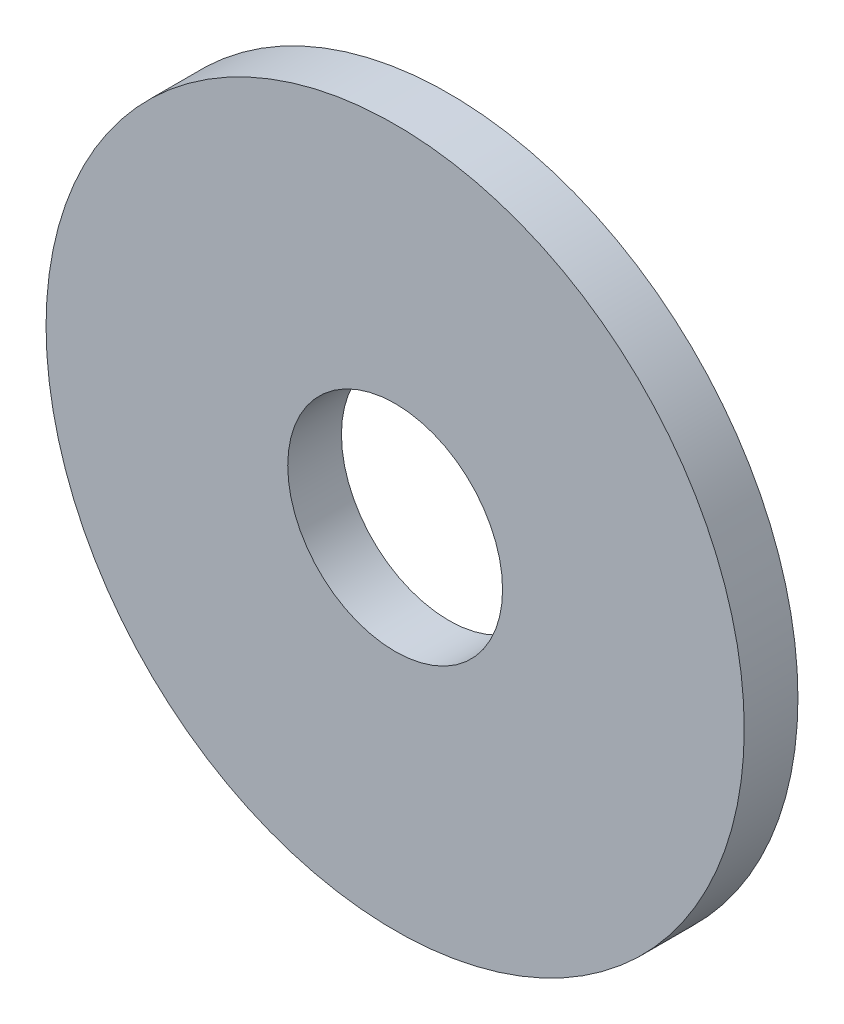
ISO-10303-21;
HEADER;
FILE_DESCRIPTION(('STEP AP214'),'2;1');
FILE_NAME('part.step','',(''),(''),'','','');
FILE_SCHEMA(('AUTOMOTIVE_DESIGN { 1 0 10303 214 1 1 1 1 }'));
ENDSEC;
DATA;
#1=APPLICATION_CONTEXT('core data for automotive mechanical design processes');
#2=APPLICATION_PROTOCOL_DEFINITION('international standard','automotive_design',2000,#1);
#3=PRODUCT_CONTEXT('',#1,'mechanical');
#4=PRODUCT('Part','Part','',(#3));
#5=PRODUCT_RELATED_PRODUCT_CATEGORY('part','',(#4));
#6=PRODUCT_DEFINITION_FORMATION('','',#4);
#7=PRODUCT_DEFINITION_CONTEXT('part definition',#1,'design');
#8=PRODUCT_DEFINITION('design','',#6,#7);
#9=PRODUCT_DEFINITION_SHAPE('','',#8);
#10=(LENGTH_UNIT() NAMED_UNIT(*) SI_UNIT(.MILLI.,.METRE.));
#11=(NAMED_UNIT(*) PLANE_ANGLE_UNIT() SI_UNIT($,.RADIAN.));
#12=(NAMED_UNIT(*) SI_UNIT($,.STERADIAN.) SOLID_ANGLE_UNIT());
#13=UNCERTAINTY_MEASURE_WITH_UNIT(LENGTH_MEASURE(1.E-05),#10,'distance_accuracy_value','');
#14=(GEOMETRIC_REPRESENTATION_CONTEXT(3) GLOBAL_UNCERTAINTY_ASSIGNED_CONTEXT((#13)) GLOBAL_UNIT_ASSIGNED_CONTEXT((#10,
#11,#12)) REPRESENTATION_CONTEXT('',''));
#15=CARTESIAN_POINT('',(0.,0.,0.));
#16=DIRECTION('',(0.,0.,1.));
#17=DIRECTION('',(1.,0.,0.));
#18=AXIS2_PLACEMENT_3D('',#15,#16,#17);
#19=CARTESIAN_POINT('',(0.,0.,0.5));
#20=DIRECTION('',(0.,0.,1.));
#21=DIRECTION('',(1.,0.,0.));
#22=AXIS2_PLACEMENT_3D('',#19,#20,#21);
#23=PLANE('',#22);
#24=CARTESIAN_POINT('',(0.,0.,0.5));
#25=DIRECTION('',(0.,0.,1.));
#26=DIRECTION('',(1.,0.,0.));
#27=AXIS2_PLACEMENT_3D('',#24,#25,#26);
#28=CIRCLE('',#27,3.25);
#29=CARTESIAN_POINT('',(3.25,0.,0.5));
#30=VERTEX_POINT('',#29);
#31=EDGE_CURVE('E10',#30,#30,#28,.T.);
#32=ORIENTED_EDGE('',*,*,#31,.T.);
#33=EDGE_LOOP('',(#32));
#34=FACE_BOUND('',#33,.T.);
#35=CARTESIAN_POINT('',(0.,0.,0.5));
#36=DIRECTION('',(0.,0.,1.));
#37=DIRECTION('',(1.,0.,0.));
#38=AXIS2_PLACEMENT_3D('',#35,#36,#37);
#39=CIRCLE('',#38,1.);
#40=CARTESIAN_POINT('',(1.,0.,0.5));
#41=VERTEX_POINT('',#40);
#42=EDGE_CURVE('E42',#41,#41,#39,.T.);
#43=ORIENTED_EDGE('',*,*,#42,.F.);
#44=EDGE_LOOP('',(#43));
#45=FACE_BOUND('',#44,.T.);
#46=ADVANCED_FACE('F31',(#34,#45),#23,.T.);
#47=CARTESIAN_POINT('',(0.,0.,0.));
#48=DIRECTION('',(0.,0.,1.));
#49=DIRECTION('',(1.,0.,0.));
#50=AXIS2_PLACEMENT_3D('',#47,#48,#49);
#51=PLANE('',#50);
#52=CARTESIAN_POINT('',(0.,0.,0.));
#53=DIRECTION('',(0.,0.,1.));
#54=DIRECTION('',(1.,0.,0.));
#55=AXIS2_PLACEMENT_3D('',#52,#53,#54);
#56=CIRCLE('',#55,3.25);
#57=CARTESIAN_POINT('',(3.25,0.,0.));
#58=VERTEX_POINT('',#57);
#59=EDGE_CURVE('E35',#58,#58,#56,.T.);
#60=ORIENTED_EDGE('',*,*,#59,.F.);
#61=EDGE_LOOP('',(#60));
#62=FACE_BOUND('',#61,.T.);
#63=CARTESIAN_POINT('',(0.,0.,0.));
#64=DIRECTION('',(0.,0.,1.));
#65=DIRECTION('',(1.,0.,0.));
#66=AXIS2_PLACEMENT_3D('',#63,#64,#65);
#67=CIRCLE('',#66,1.);
#68=CARTESIAN_POINT('',(1.,0.,0.));
#69=VERTEX_POINT('',#68);
#70=EDGE_CURVE('E44',#69,#69,#67,.T.);
#71=ORIENTED_EDGE('',*,*,#70,.T.);
#72=EDGE_LOOP('',(#71));
#73=FACE_BOUND('',#72,.T.);
#74=ADVANCED_FACE('F54',(#62,#73),#51,.F.);
#75=CARTESIAN_POINT('',(0.,0.,0.5));
#76=DIRECTION('',(0.,0.,-1.));
#77=DIRECTION('',(-1.,0.,0.));
#78=AXIS2_PLACEMENT_3D('',#75,#76,#77);
#79=CYLINDRICAL_SURFACE('',#78,3.25);
#80=ORIENTED_EDGE('',*,*,#31,.F.);
#81=EDGE_LOOP('',(#80));
#82=FACE_BOUND('',#81,.T.);
#83=ORIENTED_EDGE('',*,*,#59,.T.);
#84=EDGE_LOOP('',(#83));
#85=FACE_BOUND('',#84,.T.);
#86=ADVANCED_FACE('F33',(#82,#85),#79,.T.);
#87=CARTESIAN_POINT('',(0.,0.,0.5));
#88=DIRECTION('',(0.,0.,-1.));
#89=DIRECTION('',(-1.,0.,0.));
#90=AXIS2_PLACEMENT_3D('',#87,#88,#89);
#91=CYLINDRICAL_SURFACE('',#90,1.);
#92=ORIENTED_EDGE('',*,*,#42,.T.);
#93=EDGE_LOOP('',(#92));
#94=FACE_BOUND('',#93,.T.);
#95=ORIENTED_EDGE('',*,*,#70,.F.);
#96=EDGE_LOOP('',(#95));
#97=FACE_BOUND('',#96,.T.);
#98=ADVANCED_FACE('F50',(#94,#97),#91,.F.);
#99=CLOSED_SHELL('',(#46,#74,#86,#98));
#100=MANIFOLD_SOLID_BREP('B2',#99);
#101=ADVANCED_BREP_SHAPE_REPRESENTATION('',(#18,#100),#14);
#102=SHAPE_DEFINITION_REPRESENTATION(#9,#101);
ENDSEC;
END-ISO-10303-21;
